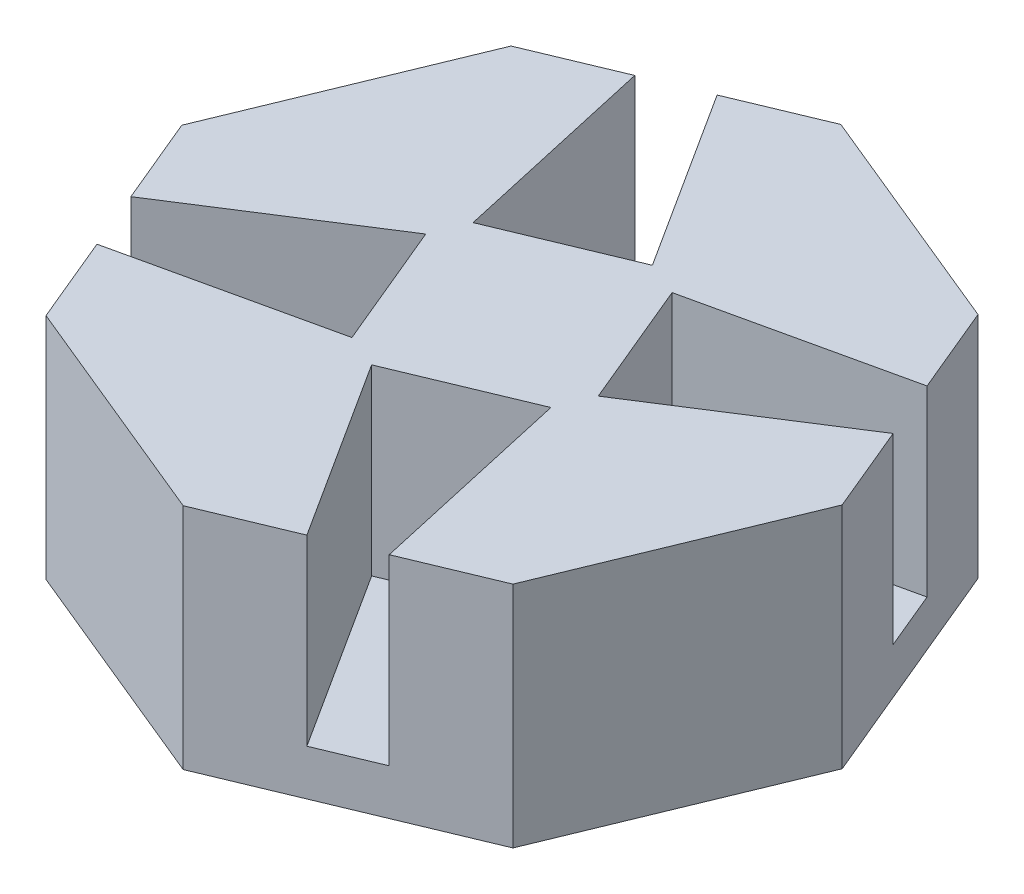
ISO-10303-21;
HEADER;
FILE_DESCRIPTION(('STEP AP214'),'2;1');
FILE_NAME('part.step','',(''),(''),'','','');
FILE_SCHEMA(('AUTOMOTIVE_DESIGN { 1 0 10303 214 1 1 1 1 }'));
ENDSEC;
DATA;
#1=APPLICATION_CONTEXT('core data for automotive mechanical design processes');
#2=APPLICATION_PROTOCOL_DEFINITION('international standard','automotive_design',2000,#1);
#3=PRODUCT_CONTEXT('',#1,'mechanical');
#4=PRODUCT('Part','Part','',(#3));
#5=PRODUCT_RELATED_PRODUCT_CATEGORY('part','',(#4));
#6=PRODUCT_DEFINITION_FORMATION('','',#4);
#7=PRODUCT_DEFINITION_CONTEXT('part definition',#1,'design');
#8=PRODUCT_DEFINITION('design','',#6,#7);
#9=PRODUCT_DEFINITION_SHAPE('','',#8);
#10=(LENGTH_UNIT() NAMED_UNIT(*) SI_UNIT(.MILLI.,.METRE.));
#11=(NAMED_UNIT(*) PLANE_ANGLE_UNIT() SI_UNIT($,.RADIAN.));
#12=(NAMED_UNIT(*) SI_UNIT($,.STERADIAN.) SOLID_ANGLE_UNIT());
#13=UNCERTAINTY_MEASURE_WITH_UNIT(LENGTH_MEASURE(1.E-05),#10,'distance_accuracy_value','');
#14=(GEOMETRIC_REPRESENTATION_CONTEXT(3) GLOBAL_UNCERTAINTY_ASSIGNED_CONTEXT((#13)) GLOBAL_UNIT_ASSIGNED_CONTEXT((#10,
#11,#12)) REPRESENTATION_CONTEXT('',''));
#15=CARTESIAN_POINT('',(0.,0.,0.));
#16=DIRECTION('',(0.,0.,1.));
#17=DIRECTION('',(1.,0.,0.));
#18=AXIS2_PLACEMENT_3D('',#15,#16,#17);
#19=CARTESIAN_POINT('',(-0.111992667325423,38.1,-54.9379232963896));
#20=DIRECTION('',(0.384565990508202,0.,0.923097502403969));
#21=DIRECTION('',(0.923097502403969,0.,-0.384565990508202));
#22=AXIS2_PLACEMENT_3D('',#19,#20,#21);
#23=PLANE('',#22);
#24=DIRECTION('',(0.,1.,0.));
#25=VECTOR('',#24,1.);
#26=CARTESIAN_POINT('',(-24.364776500772,7.62000000000001,-44.8341197293759));
#27=LINE('',#26,#25);
#28=CARTESIAN_POINT('',(-24.364776500772,7.62000000000001,-44.8341197293759));
#29=VERTEX_POINT('',#28);
#30=CARTESIAN_POINT('',(-24.364776500772,38.1,-44.8341197293759));
#31=VERTEX_POINT('',#30);
#32=EDGE_CURVE('E248',#29,#31,#27,.T.);
#33=ORIENTED_EDGE('',*,*,#32,.F.);
#34=DIRECTION('',(-0.923097502403969,0.,0.384565990508202));
#35=VECTOR('',#34,1.);
#36=CARTESIAN_POINT('',(-19.5190807745089,7.62000000000001,-46.8528553145321));
#37=LINE('',#36,#35);
#38=CARTESIAN_POINT('',(-14.6733850482383,7.62000000000001,-48.8715908996914));
#39=VERTEX_POINT('',#38);
#40=EDGE_CURVE('E272',#39,#29,#37,.T.);
#41=ORIENTED_EDGE('',*,*,#40,.F.);
#42=DIRECTION('',(0.,1.,0.));
#43=VECTOR('',#42,1.);
#44=CARTESIAN_POINT('',(-14.6733850482383,7.62000000000001,-48.8715908996914));
#45=LINE('',#44,#43);
#46=CARTESIAN_POINT('',(-14.6733850482383,38.1,-48.8715908996914));
#47=VERTEX_POINT('',#46);
#48=EDGE_CURVE('E288',#39,#47,#45,.T.);
#49=ORIENTED_EDGE('',*,*,#48,.T.);
#50=DIRECTION('',(-0.923097502403969,0.,0.384565990508202));
#51=VECTOR('',#50,1.);
#52=CARTESIAN_POINT('',(-0.111992667325423,38.1,-54.9379232963896));
#53=LINE('',#52,#51);
#54=CARTESIAN_POINT('',(-0.111992667325423,38.1,-54.9379232963896));
#55=VERTEX_POINT('',#54);
#56=EDGE_CURVE('E379',#55,#47,#53,.T.);
#57=ORIENTED_EDGE('',*,*,#56,.F.);
#58=DIRECTION('',(0.,-1.,0.));
#59=VECTOR('',#58,1.);
#60=CARTESIAN_POINT('',(-0.111992667325423,38.1,-54.9379232963896));
#61=LINE('',#60,#59);
#62=CARTESIAN_POINT('',(-0.111992667325423,0.,-54.9379232963896));
#63=VERTEX_POINT('',#62);
#64=EDGE_CURVE('E11',#55,#63,#61,.T.);
#65=ORIENTED_EDGE('',*,*,#64,.T.);
#66=DIRECTION('',(-0.923097502403969,0.,0.384565990508202));
#67=VECTOR('',#66,1.);
#68=CARTESIAN_POINT('',(-0.111992667325423,0.,-54.9379232963896));
#69=LINE('',#68,#67);
#70=CARTESIAN_POINT('',(-38.9261688816924,0.,-38.7677873326745));
#71=VERTEX_POINT('',#70);
#72=EDGE_CURVE('E411',#63,#71,#69,.T.);
#73=ORIENTED_EDGE('',*,*,#72,.T.);
#74=DIRECTION('',(0.,-1.,0.));
#75=VECTOR('',#74,1.);
#76=CARTESIAN_POINT('',(-38.9261688816924,38.1,-38.7677873326745));
#77=LINE('',#76,#75);
#78=CARTESIAN_POINT('',(-38.9261688816924,38.1,-38.7677873326745));
#79=VERTEX_POINT('',#78);
#80=EDGE_CURVE('E54',#79,#71,#77,.T.);
#81=ORIENTED_EDGE('',*,*,#80,.F.);
#82=EDGE_CURVE('E377',#31,#79,#53,.T.);
#83=ORIENTED_EDGE('',*,*,#82,.F.);
#84=EDGE_LOOP('',(#33,#41,#49,#57,#65,#73,#81,#83));
#85=FACE_BOUND('',#84,.T.);
#86=ADVANCED_FACE('F45',(#85),#23,.F.);
#87=CARTESIAN_POINT('',(-54.9379232963896,38.1,0.111992667325427));
#88=DIRECTION('',(0.923097502403969,0.,-0.384565990508202));
#89=DIRECTION('',(-0.384565990508203,0.,-0.923097502403969));
#90=AXIS2_PLACEMENT_3D('',#87,#88,#89);
#91=PLANE('',#90);
#92=DIRECTION('',(0.,1.,0.));
#93=VECTOR('',#92,1.);
#94=CARTESIAN_POINT('',(-44.8341197293752,7.62000000000001,24.3647765007735));
#95=LINE('',#94,#93);
#96=CARTESIAN_POINT('',(-44.8341197293752,7.62000000000001,24.3647765007735));
#97=VERTEX_POINT('',#96);
#98=CARTESIAN_POINT('',(-44.8341197293752,38.1,24.3647765007735));
#99=VERTEX_POINT('',#98);
#100=EDGE_CURVE('E251',#97,#99,#95,.T.);
#101=ORIENTED_EDGE('',*,*,#100,.F.);
#102=DIRECTION('',(0.384565990508203,0.,0.923097502403969));
#103=VECTOR('',#102,1.);
#104=CARTESIAN_POINT('',(-46.8528553145321,7.62000000000001,19.5190807745089));
#105=LINE('',#104,#103);
#106=CARTESIAN_POINT('',(-48.8715908996905,7.62000000000001,14.6733850482405));
#107=VERTEX_POINT('',#106);
#108=EDGE_CURVE('E230',#107,#97,#105,.T.);
#109=ORIENTED_EDGE('',*,*,#108,.F.);
#110=DIRECTION('',(0.,1.,0.));
#111=VECTOR('',#110,1.);
#112=CARTESIAN_POINT('',(-48.8715908996905,7.62000000000001,14.6733850482405));
#113=LINE('',#112,#111);
#114=CARTESIAN_POINT('',(-48.8715908996905,38.1,14.6733850482405));
#115=VERTEX_POINT('',#114);
#116=EDGE_CURVE('E255',#107,#115,#113,.T.);
#117=ORIENTED_EDGE('',*,*,#116,.T.);
#118=DIRECTION('',(0.384565990508203,0.,0.923097502403969));
#119=VECTOR('',#118,1.);
#120=CARTESIAN_POINT('',(-54.9379232963896,38.1,0.111992667325427));
#121=LINE('',#120,#119);
#122=CARTESIAN_POINT('',(-54.9379232963896,38.1,0.111992667325427));
#123=VERTEX_POINT('',#122);
#124=EDGE_CURVE('E387',#123,#115,#121,.T.);
#125=ORIENTED_EDGE('',*,*,#124,.F.);
#126=DIRECTION('',(0.,-1.,0.));
#127=VECTOR('',#126,1.);
#128=CARTESIAN_POINT('',(-54.9379232963896,38.1,0.111992667325427));
#129=LINE('',#128,#127);
#130=CARTESIAN_POINT('',(-54.9379232963896,0.,0.111992667325427));
#131=VERTEX_POINT('',#130);
#132=EDGE_CURVE('E450',#123,#131,#129,.T.);
#133=ORIENTED_EDGE('',*,*,#132,.T.);
#134=DIRECTION('',(0.384565990508203,0.,0.923097502403969));
#135=VECTOR('',#134,1.);
#136=CARTESIAN_POINT('',(-54.9379232963896,0.,0.111992667325427));
#137=LINE('',#136,#135);
#138=CARTESIAN_POINT('',(-38.7677873326745,0.,38.9261688816925));
#139=VERTEX_POINT('',#138);
#140=EDGE_CURVE('E417',#131,#139,#137,.T.);
#141=ORIENTED_EDGE('',*,*,#140,.T.);
#142=DIRECTION('',(0.,-1.,0.));
#143=VECTOR('',#142,1.);
#144=CARTESIAN_POINT('',(-38.7677873326745,38.1,38.9261688816925));
#145=LINE('',#144,#143);
#146=CARTESIAN_POINT('',(-38.7677873326745,38.1,38.9261688816925));
#147=VERTEX_POINT('',#146);
#148=EDGE_CURVE('E446',#147,#139,#145,.T.);
#149=ORIENTED_EDGE('',*,*,#148,.F.);
#150=EDGE_CURVE('E386',#99,#147,#121,.T.);
#151=ORIENTED_EDGE('',*,*,#150,.F.);
#152=EDGE_LOOP('',(#101,#109,#117,#125,#133,#141,#149,#151));
#153=FACE_BOUND('',#152,.T.);
#154=ADVANCED_FACE('F471',(#153),#91,.F.);
#155=CARTESIAN_POINT('',(0.111992667325429,38.1,54.9379232963896));
#156=DIRECTION('',(-0.384565990508203,0.,-0.923097502403969));
#157=DIRECTION('',(-0.923097502403969,0.,0.384565990508203));
#158=AXIS2_PLACEMENT_3D('',#155,#156,#157);
#159=PLANE('',#158);
#160=DIRECTION('',(0.,1.,0.));
#161=VECTOR('',#160,1.);
#162=CARTESIAN_POINT('',(24.3647765007757,7.62000000000001,44.8341197293743));
#163=LINE('',#162,#161);
#164=CARTESIAN_POINT('',(24.3647765007757,7.62000000000001,44.8341197293743));
#165=VERTEX_POINT('',#164);
#166=CARTESIAN_POINT('',(24.3647765007757,38.1,44.8341197293743));
#167=VERTEX_POINT('',#166);
#168=EDGE_CURVE('E363',#165,#167,#163,.T.);
#169=ORIENTED_EDGE('',*,*,#168,.F.);
#170=DIRECTION('',(0.923097502403969,0.,-0.384565990508203));
#171=VECTOR('',#170,1.);
#172=CARTESIAN_POINT('',(19.519080774509,7.62000000000001,46.8528553145321));
#173=LINE('',#172,#171);
#174=CARTESIAN_POINT('',(14.673385048242,7.62000000000001,48.8715908996899));
#175=VERTEX_POINT('',#174);
#176=EDGE_CURVE('E341',#175,#165,#173,.T.);
#177=ORIENTED_EDGE('',*,*,#176,.F.);
#178=DIRECTION('',(0.,1.,0.));
#179=VECTOR('',#178,1.);
#180=CARTESIAN_POINT('',(14.673385048242,7.62000000000001,48.8715908996899));
#181=LINE('',#180,#179);
#182=CARTESIAN_POINT('',(14.673385048242,38.1,48.8715908996899));
#183=VERTEX_POINT('',#182);
#184=EDGE_CURVE('E366',#175,#183,#181,.T.);
#185=ORIENTED_EDGE('',*,*,#184,.T.);
#186=DIRECTION('',(0.923097502403969,0.,-0.384565990508203));
#187=VECTOR('',#186,1.);
#188=CARTESIAN_POINT('',(0.111992667325429,38.1,54.9379232963896));
#189=LINE('',#188,#187);
#190=CARTESIAN_POINT('',(0.111992667325429,38.1,54.9379232963896));
#191=VERTEX_POINT('',#190);
#192=EDGE_CURVE('E395',#191,#183,#189,.T.);
#193=ORIENTED_EDGE('',*,*,#192,.F.);
#194=DIRECTION('',(0.,-1.,0.));
#195=VECTOR('',#194,1.);
#196=CARTESIAN_POINT('',(0.111992667325429,38.1,54.9379232963896));
#197=LINE('',#196,#195);
#198=CARTESIAN_POINT('',(0.111992667325429,0.,54.9379232963896));
#199=VERTEX_POINT('',#198);
#200=EDGE_CURVE('E442',#191,#199,#197,.T.);
#201=ORIENTED_EDGE('',*,*,#200,.T.);
#202=DIRECTION('',(0.923097502403969,0.,-0.384565990508203));
#203=VECTOR('',#202,1.);
#204=CARTESIAN_POINT('',(0.111992667325429,0.,54.9379232963896));
#205=LINE('',#204,#203);
#206=CARTESIAN_POINT('',(38.9261688816925,0.,38.7677873326745));
#207=VERTEX_POINT('',#206);
#208=EDGE_CURVE('E423',#199,#207,#205,.T.);
#209=ORIENTED_EDGE('',*,*,#208,.T.);
#210=DIRECTION('',(0.,-1.,0.));
#211=VECTOR('',#210,1.);
#212=CARTESIAN_POINT('',(38.9261688816925,38.1,38.7677873326745));
#213=LINE('',#212,#211);
#214=CARTESIAN_POINT('',(38.9261688816925,38.1,38.7677873326745));
#215=VERTEX_POINT('',#214);
#216=EDGE_CURVE('E438',#215,#207,#213,.T.);
#217=ORIENTED_EDGE('',*,*,#216,.F.);
#218=EDGE_CURVE('E394',#167,#215,#189,.T.);
#219=ORIENTED_EDGE('',*,*,#218,.F.);
#220=EDGE_LOOP('',(#169,#177,#185,#193,#201,#209,#217,#219));
#221=FACE_BOUND('',#220,.T.);
#222=ADVANCED_FACE('F515',(#221),#159,.F.);
#223=CARTESIAN_POINT('',(54.9379232963896,38.1,-0.111992667325405));
#224=DIRECTION('',(-0.923097502403969,0.,0.384565990508202));
#225=DIRECTION('',(0.384565990508202,0.,0.923097502403969));
#226=AXIS2_PLACEMENT_3D('',#223,#224,#225);
#227=PLANE('',#226);
#228=DIRECTION('',(0.,1.,0.));
#229=VECTOR('',#228,1.);
#230=CARTESIAN_POINT('',(44.834119729375,7.62000000000001,-24.3647765007741));
#231=LINE('',#230,#229);
#232=CARTESIAN_POINT('',(44.834119729375,7.62000000000001,-24.3647765007741));
#233=VERTEX_POINT('',#232);
#234=CARTESIAN_POINT('',(44.834119729375,38.1,-24.3647765007741));
#235=VERTEX_POINT('',#234);
#236=EDGE_CURVE('E280',#233,#235,#231,.T.);
#237=ORIENTED_EDGE('',*,*,#236,.F.);
#238=DIRECTION('',(-0.384565990508202,0.,-0.923097502403969));
#239=VECTOR('',#238,1.);
#240=CARTESIAN_POINT('',(46.8528553145321,7.62000000000001,-19.5190807745089));
#241=LINE('',#240,#239);
#242=CARTESIAN_POINT('',(48.8715908996908,7.62000000000001,-14.6733850482398));
#243=VERTEX_POINT('',#242);
#244=EDGE_CURVE('E308',#243,#233,#241,.T.);
#245=ORIENTED_EDGE('',*,*,#244,.F.);
#246=DIRECTION('',(0.,1.,0.));
#247=VECTOR('',#246,1.);
#248=CARTESIAN_POINT('',(48.8715908996908,7.62000000000001,-14.6733850482398));
#249=LINE('',#248,#247);
#250=CARTESIAN_POINT('',(48.8715908996908,38.1,-14.6733850482398));
#251=VERTEX_POINT('',#250);
#252=EDGE_CURVE('E323',#243,#251,#249,.T.);
#253=ORIENTED_EDGE('',*,*,#252,.T.);
#254=DIRECTION('',(-0.384565990508202,0.,-0.923097502403969));
#255=VECTOR('',#254,1.);
#256=CARTESIAN_POINT('',(54.9379232963896,38.1,-0.111992667325405));
#257=LINE('',#256,#255);
#258=CARTESIAN_POINT('',(54.9379232963896,38.1,-0.111992667325405));
#259=VERTEX_POINT('',#258);
#260=EDGE_CURVE('E403',#259,#251,#257,.T.);
#261=ORIENTED_EDGE('',*,*,#260,.F.);
#262=DIRECTION('',(0.,-1.,0.));
#263=VECTOR('',#262,1.);
#264=CARTESIAN_POINT('',(54.9379232963896,38.1,-0.111992667325405));
#265=LINE('',#264,#263);
#266=CARTESIAN_POINT('',(54.9379232963896,0.,-0.111992667325405));
#267=VERTEX_POINT('',#266);
#268=EDGE_CURVE('E434',#259,#267,#265,.T.);
#269=ORIENTED_EDGE('',*,*,#268,.T.);
#270=DIRECTION('',(-0.384565990508202,0.,-0.923097502403969));
#271=VECTOR('',#270,1.);
#272=CARTESIAN_POINT('',(54.9379232963896,0.,-0.111992667325405));
#273=LINE('',#272,#271);
#274=CARTESIAN_POINT('',(38.7677873326746,0.,-38.9261688816924));
#275=VERTEX_POINT('',#274);
#276=EDGE_CURVE('E378',#267,#275,#273,.T.);
#277=ORIENTED_EDGE('',*,*,#276,.T.);
#278=DIRECTION('',(0.,-1.,0.));
#279=VECTOR('',#278,1.);
#280=CARTESIAN_POINT('',(38.7677873326746,38.1,-38.9261688816924));
#281=LINE('',#280,#279);
#282=CARTESIAN_POINT('',(38.7677873326746,38.1,-38.9261688816924));
#283=VERTEX_POINT('',#282);
#284=EDGE_CURVE('E407',#283,#275,#281,.T.);
#285=ORIENTED_EDGE('',*,*,#284,.F.);
#286=EDGE_CURVE('E402',#235,#283,#257,.T.);
#287=ORIENTED_EDGE('',*,*,#286,.F.);
#288=EDGE_LOOP('',(#237,#245,#253,#261,#269,#277,#285,#287));
#289=FACE_BOUND('',#288,.T.);
#290=ADVANCED_FACE('F505',(#289),#227,.F.);
#291=CARTESIAN_POINT('',(0.,38.1,0.));
#292=DIRECTION('',(0.,1.,0.));
#293=DIRECTION('',(0.,0.,1.));
#294=AXIS2_PLACEMENT_3D('',#291,#292,#293);
#295=PLANE('',#294);
#296=DIRECTION('',(-0.384565990508192,0.,-0.923097502403973));
#297=VECTOR('',#296,1.);
#298=CARTESIAN_POINT('',(14.4964416602701,38.1,-6.03927367521602));
#299=LINE('',#298,#297);
#300=CARTESIAN_POINT('',(18.8920309317793,38.1,4.51173077726273));
#301=VERTEX_POINT('',#300);
#302=CARTESIAN_POINT('',(10.100852388762,38.1,-16.5902781276921));
#303=VERTEX_POINT('',#302);
#304=EDGE_CURVE('E315',#301,#303,#299,.T.);
#305=ORIENTED_EDGE('',*,*,#304,.T.);
#306=DIRECTION('',(0.975852760598065,0.,-0.218429369895938));
#307=VECTOR('',#306,1.);
#308=CARTESIAN_POINT('',(-3.05437343120183,38.1,-13.645686686528));
#309=LINE('',#308,#307);
#310=EDGE_CURVE('E61',#303,#235,#309,.T.);
#311=ORIENTED_EDGE('',*,*,#310,.T.);
#312=ORIENTED_EDGE('',*,*,#286,.T.);
#313=DIRECTION('',(-0.924657723348283,0.,-0.38079928394414));
#314=VECTOR('',#313,1.);
#315=CARTESIAN_POINT('',(38.7677873326746,38.1,-38.9261688816924));
#316=LINE('',#315,#314);
#317=EDGE_CURVE('E373',#283,#55,#316,.T.);
#318=ORIENTED_EDGE('',*,*,#317,.T.);
#319=ORIENTED_EDGE('',*,*,#56,.T.);
#320=DIRECTION('',(-0.539017768098629,0.,-0.842294393709214));
#321=VECTOR('',#320,1.);
#322=CARTESIAN_POINT('',(11.7780938461807,38.1,-7.53727189073072));
#323=LINE('',#322,#321);
#324=CARTESIAN_POINT('',(4.51173077726535,38.1,-18.8920309317781));
#325=VERTEX_POINT('',#324);
#326=EDGE_CURVE('E265',#325,#47,#323,.T.);
#327=ORIENTED_EDGE('',*,*,#326,.F.);
#328=DIRECTION('',(-0.923097502403973,0.,0.384565990508192));
#329=VECTOR('',#328,1.);
#330=CARTESIAN_POINT('',(-6.03927367521523,38.1,-14.4964416602682));
#331=LINE('',#330,#329);
#332=CARTESIAN_POINT('',(-16.5902781276895,38.1,-10.1008523887609));
#333=VERTEX_POINT('',#332);
#334=EDGE_CURVE('E279',#325,#333,#331,.T.);
#335=ORIENTED_EDGE('',*,*,#334,.T.);
#336=DIRECTION('',(-0.218429369895938,0.,-0.975852760598065));
#337=VECTOR('',#336,1.);
#338=CARTESIAN_POINT('',(-13.6456866865257,38.1,3.05437343120133));
#339=LINE('',#338,#337);
#340=EDGE_CURVE('E69',#333,#31,#339,.T.);
#341=ORIENTED_EDGE('',*,*,#340,.T.);
#342=ORIENTED_EDGE('',*,*,#82,.T.);
#343=DIRECTION('',(-0.38079928394414,0.,0.924657723348283));
#344=VECTOR('',#343,1.);
#345=CARTESIAN_POINT('',(-38.9261688816924,38.1,-38.7677873326745));
#346=LINE('',#345,#344);
#347=EDGE_CURVE('E383',#79,#123,#346,.T.);
#348=ORIENTED_EDGE('',*,*,#347,.T.);
#349=ORIENTED_EDGE('',*,*,#124,.T.);
#350=DIRECTION('',(-0.842294393709214,0.,0.539017768098629));
#351=VECTOR('',#350,1.);
#352=CARTESIAN_POINT('',(-7.53727189072944,38.1,-11.7780938461787));
#353=LINE('',#352,#351);
#354=CARTESIAN_POINT('',(-18.8920309317755,38.1,-4.51173077726422));
#355=VERTEX_POINT('',#354);
#356=EDGE_CURVE('E236',#355,#115,#353,.T.);
#357=ORIENTED_EDGE('',*,*,#356,.F.);
#358=DIRECTION('',(0.384565990508192,0.,0.923097502403973));
#359=VECTOR('',#358,1.);
#360=CARTESIAN_POINT('',(-14.4964416602663,38.1,6.03927367521447));
#361=LINE('',#360,#359);
#362=CARTESIAN_POINT('',(-10.1008523887582,38.1,16.5902781276906));
#363=VERTEX_POINT('',#362);
#364=EDGE_CURVE('E239',#355,#363,#361,.T.);
#365=ORIENTED_EDGE('',*,*,#364,.T.);
#366=DIRECTION('',(-0.975852760598065,0.,0.218429369895938));
#367=VECTOR('',#366,1.);
#368=CARTESIAN_POINT('',(3.05437343120169,38.1,13.6456866865273));
#369=LINE('',#368,#367);
#370=EDGE_CURVE('E228',#363,#99,#369,.T.);
#371=ORIENTED_EDGE('',*,*,#370,.T.);
#372=ORIENTED_EDGE('',*,*,#150,.T.);
#373=DIRECTION('',(0.924657723348283,0.,0.38079928394414));
#374=VECTOR('',#373,1.);
#375=CARTESIAN_POINT('',(-38.7677873326745,38.1,38.9261688816925));
#376=LINE('',#375,#374);
#377=EDGE_CURVE('E391',#147,#191,#376,.T.);
#378=ORIENTED_EDGE('',*,*,#377,.T.);
#379=ORIENTED_EDGE('',*,*,#192,.T.);
#380=DIRECTION('',(0.539017768098629,0.,0.842294393709214));
#381=VECTOR('',#380,1.);
#382=CARTESIAN_POINT('',(-11.7780938461774,38.1,7.53727189072858));
#383=LINE('',#382,#381);
#384=CARTESIAN_POINT('',(-4.5117307772616,38.1,18.8920309317766));
#385=VERTEX_POINT('',#384);
#386=EDGE_CURVE('E352',#385,#183,#383,.T.);
#387=ORIENTED_EDGE('',*,*,#386,.F.);
#388=DIRECTION('',(0.923097502403973,0.,-0.384565990508192));
#389=VECTOR('',#388,1.);
#390=CARTESIAN_POINT('',(6.03927367521526,38.1,14.4964416602682));
#391=LINE('',#390,#389);
#392=CARTESIAN_POINT('',(16.5902781276932,38.1,10.1008523887594));
#393=VERTEX_POINT('',#392);
#394=EDGE_CURVE('E254',#385,#393,#391,.T.);
#395=ORIENTED_EDGE('',*,*,#394,.T.);
#396=DIRECTION('',(0.218429369895938,0.,0.975852760598065));
#397=VECTOR('',#396,1.);
#398=CARTESIAN_POINT('',(13.6456866865296,38.1,-3.05437343120219));
#399=LINE('',#398,#397);
#400=EDGE_CURVE('E337',#393,#167,#399,.T.);
#401=ORIENTED_EDGE('',*,*,#400,.T.);
#402=ORIENTED_EDGE('',*,*,#218,.T.);
#403=DIRECTION('',(0.38079928394414,0.,-0.924657723348283));
#404=VECTOR('',#403,1.);
#405=CARTESIAN_POINT('',(38.9261688816925,38.1,38.7677873326745));
#406=LINE('',#405,#404);
#407=EDGE_CURVE('E399',#215,#259,#406,.T.);
#408=ORIENTED_EDGE('',*,*,#407,.T.);
#409=ORIENTED_EDGE('',*,*,#260,.T.);
#410=DIRECTION('',(0.842294393709214,0.,-0.539017768098629));
#411=VECTOR('',#410,1.);
#412=CARTESIAN_POINT('',(7.53727189072986,38.1,11.7780938461794));
#413=LINE('',#412,#411);
#414=EDGE_CURVE('E301',#301,#251,#413,.T.);
#415=ORIENTED_EDGE('',*,*,#414,.F.);
#416=EDGE_LOOP('',(#305,#311,#312,#318,#319,#327,#335,#341,#342,#348,#349,#357,#365,#371,#372,
#378,#379,#387,#395,#401,#402,#408,#409,#415));
#417=FACE_BOUND('',#416,.T.);
#418=ADVANCED_FACE('F480',(#417),#295,.T.);
#419=CARTESIAN_POINT('',(38.7677873326746,38.1,-38.9261688816924));
#420=DIRECTION('',(-0.38079928394414,0.,0.924657723348283));
#421=DIRECTION('',(0.924657723348283,0.,0.38079928394414));
#422=AXIS2_PLACEMENT_3D('',#419,#420,#421);
#423=PLANE('',#422);
#424=DIRECTION('',(-0.924657723348283,0.,-0.38079928394414));
#425=VECTOR('',#424,1.);
#426=CARTESIAN_POINT('',(38.7677873326746,0.,-38.9261688816924));
#427=LINE('',#426,#425);
#428=EDGE_CURVE('E362',#275,#63,#427,.T.);
#429=ORIENTED_EDGE('',*,*,#428,.T.);
#430=ORIENTED_EDGE('',*,*,#64,.F.);
#431=ORIENTED_EDGE('',*,*,#317,.F.);
#432=ORIENTED_EDGE('',*,*,#284,.T.);
#433=EDGE_LOOP('',(#429,#430,#431,#432));
#434=FACE_BOUND('',#433,.T.);
#435=ADVANCED_FACE('F47',(#434),#423,.F.);
#436=CARTESIAN_POINT('',(-38.9261688816924,38.1,-38.7677873326745));
#437=DIRECTION('',(0.924657723348283,0.,0.38079928394414));
#438=DIRECTION('',(0.38079928394414,0.,-0.924657723348283));
#439=AXIS2_PLACEMENT_3D('',#436,#437,#438);
#440=PLANE('',#439);
#441=DIRECTION('',(-0.38079928394414,0.,0.924657723348283));
#442=VECTOR('',#441,1.);
#443=CARTESIAN_POINT('',(-38.9261688816924,0.,-38.7677873326745));
#444=LINE('',#443,#442);
#445=EDGE_CURVE('E414',#71,#131,#444,.T.);
#446=ORIENTED_EDGE('',*,*,#445,.T.);
#447=ORIENTED_EDGE('',*,*,#132,.F.);
#448=ORIENTED_EDGE('',*,*,#347,.F.);
#449=ORIENTED_EDGE('',*,*,#80,.T.);
#450=EDGE_LOOP('',(#446,#447,#448,#449));
#451=FACE_BOUND('',#450,.T.);
#452=ADVANCED_FACE('F459',(#451),#440,.F.);
#453=CARTESIAN_POINT('',(-38.7677873326745,38.1,38.9261688816925));
#454=DIRECTION('',(0.38079928394414,0.,-0.924657723348283));
#455=DIRECTION('',(-0.924657723348283,0.,-0.38079928394414));
#456=AXIS2_PLACEMENT_3D('',#453,#454,#455);
#457=PLANE('',#456);
#458=DIRECTION('',(0.924657723348283,0.,0.38079928394414));
#459=VECTOR('',#458,1.);
#460=CARTESIAN_POINT('',(-38.7677873326745,0.,38.9261688816925));
#461=LINE('',#460,#459);
#462=EDGE_CURVE('E420',#139,#199,#461,.T.);
#463=ORIENTED_EDGE('',*,*,#462,.T.);
#464=ORIENTED_EDGE('',*,*,#200,.F.);
#465=ORIENTED_EDGE('',*,*,#377,.F.);
#466=ORIENTED_EDGE('',*,*,#148,.T.);
#467=EDGE_LOOP('',(#463,#464,#465,#466));
#468=FACE_BOUND('',#467,.T.);
#469=ADVANCED_FACE('F476',(#468),#457,.F.);
#470=CARTESIAN_POINT('',(38.9261688816925,38.1,38.7677873326745));
#471=DIRECTION('',(-0.924657723348283,0.,-0.38079928394414));
#472=DIRECTION('',(-0.38079928394414,0.,0.924657723348283));
#473=AXIS2_PLACEMENT_3D('',#470,#471,#472);
#474=PLANE('',#473);
#475=DIRECTION('',(0.38079928394414,0.,-0.924657723348283));
#476=VECTOR('',#475,1.);
#477=CARTESIAN_POINT('',(38.9261688816925,0.,38.7677873326745));
#478=LINE('',#477,#476);
#479=EDGE_CURVE('E426',#207,#267,#478,.T.);
#480=ORIENTED_EDGE('',*,*,#479,.T.);
#481=ORIENTED_EDGE('',*,*,#268,.F.);
#482=ORIENTED_EDGE('',*,*,#407,.F.);
#483=ORIENTED_EDGE('',*,*,#216,.T.);
#484=EDGE_LOOP('',(#480,#481,#482,#483));
#485=FACE_BOUND('',#484,.T.);
#486=ADVANCED_FACE('F510',(#485),#474,.F.);
#487=CARTESIAN_POINT('',(0.,0.,0.));
#488=DIRECTION('',(0.,1.,0.));
#489=DIRECTION('',(0.,0.,1.));
#490=AXIS2_PLACEMENT_3D('',#487,#488,#489);
#491=PLANE('',#490);
#492=ORIENTED_EDGE('',*,*,#428,.F.);
#493=ORIENTED_EDGE('',*,*,#276,.F.);
#494=ORIENTED_EDGE('',*,*,#479,.F.);
#495=ORIENTED_EDGE('',*,*,#208,.F.);
#496=ORIENTED_EDGE('',*,*,#462,.F.);
#497=ORIENTED_EDGE('',*,*,#140,.F.);
#498=ORIENTED_EDGE('',*,*,#445,.F.);
#499=ORIENTED_EDGE('',*,*,#72,.F.);
#500=EDGE_LOOP('',(#492,#493,#494,#495,#496,#497,#498,#499));
#501=FACE_BOUND('',#500,.T.);
#502=ADVANCED_FACE('F466',(#501),#491,.F.);
#503=CARTESIAN_POINT('',(6.03927367521526,7.62000000000001,14.4964416602682));
#504=DIRECTION('',(0.384565990508192,0.,0.923097502403973));
#505=DIRECTION('',(0.923097502403973,0.,-0.384565990508192));
#506=AXIS2_PLACEMENT_3D('',#503,#504,#505);
#507=PLANE('',#506);
#508=ORIENTED_EDGE('',*,*,#394,.F.);
#509=DIRECTION('',(0.,1.,0.));
#510=VECTOR('',#509,1.);
#511=CARTESIAN_POINT('',(-4.5117307772616,7.62000000000001,18.8920309317766));
#512=LINE('',#511,#510);
#513=CARTESIAN_POINT('',(-4.5117307772616,7.62000000000001,18.8920309317766));
#514=VERTEX_POINT('',#513);
#515=EDGE_CURVE('E348',#514,#385,#512,.T.);
#516=ORIENTED_EDGE('',*,*,#515,.F.);
#517=DIRECTION('',(0.923097502403973,0.,-0.384565990508192));
#518=VECTOR('',#517,1.);
#519=CARTESIAN_POINT('',(6.03927367521526,7.62000000000001,14.4964416602682));
#520=LINE('',#519,#518);
#521=CARTESIAN_POINT('',(16.5902781276932,7.62000000000001,10.1008523887594));
#522=VERTEX_POINT('',#521);
#523=EDGE_CURVE('E332',#514,#522,#520,.T.);
#524=ORIENTED_EDGE('',*,*,#523,.T.);
#525=DIRECTION('',(0.,1.,0.));
#526=VECTOR('',#525,1.);
#527=CARTESIAN_POINT('',(16.5902781276932,7.62000000000001,10.1008523887594));
#528=LINE('',#527,#526);
#529=EDGE_CURVE('E358',#522,#393,#528,.T.);
#530=ORIENTED_EDGE('',*,*,#529,.T.);
#531=EDGE_LOOP('',(#508,#516,#524,#530));
#532=FACE_BOUND('',#531,.T.);
#533=ADVANCED_FACE('F525',(#532),#507,.T.);
#534=CARTESIAN_POINT('',(13.6456866865296,7.62000000000001,-3.05437343120219));
#535=DIRECTION('',(-0.975852760598065,0.,0.218429369895938));
#536=DIRECTION('',(0.218429369895938,0.,0.975852760598065));
#537=AXIS2_PLACEMENT_3D('',#534,#535,#536);
#538=PLANE('',#537);
#539=ORIENTED_EDGE('',*,*,#400,.F.);
#540=ORIENTED_EDGE('',*,*,#529,.F.);
#541=DIRECTION('',(0.218429369895938,0.,0.975852760598065));
#542=VECTOR('',#541,1.);
#543=CARTESIAN_POINT('',(13.6456866865296,7.62000000000001,-3.05437343120219));
#544=LINE('',#543,#542);
#545=EDGE_CURVE('E345',#522,#165,#544,.T.);
#546=ORIENTED_EDGE('',*,*,#545,.T.);
#547=ORIENTED_EDGE('',*,*,#168,.T.);
#548=EDGE_LOOP('',(#539,#540,#546,#547));
#549=FACE_BOUND('',#548,.T.);
#550=ADVANCED_FACE('F527',(#549),#538,.T.);
#551=CARTESIAN_POINT('',(-11.7780938461774,7.62000000000001,7.53727189072858));
#552=DIRECTION('',(-0.842294393709214,0.,0.539017768098629));
#553=DIRECTION('',(0.539017768098629,0.,0.842294393709214));
#554=AXIS2_PLACEMENT_3D('',#551,#552,#553);
#555=PLANE('',#554);
#556=ORIENTED_EDGE('',*,*,#386,.T.);
#557=ORIENTED_EDGE('',*,*,#184,.F.);
#558=DIRECTION('',(0.539017768098629,0.,0.842294393709214));
#559=VECTOR('',#558,1.);
#560=CARTESIAN_POINT('',(-11.7780938461774,7.62000000000001,7.53727189072858));
#561=LINE('',#560,#559);
#562=EDGE_CURVE('E336',#514,#175,#561,.T.);
#563=ORIENTED_EDGE('',*,*,#562,.F.);
#564=ORIENTED_EDGE('',*,*,#515,.T.);
#565=EDGE_LOOP('',(#556,#557,#563,#564));
#566=FACE_BOUND('',#565,.T.);
#567=ADVANCED_FACE('F519',(#566),#555,.F.);
#568=CARTESIAN_POINT('',(0.,7.62000000000001,0.));
#569=DIRECTION('',(0.,1.,0.));
#570=DIRECTION('',(0.,0.,1.));
#571=AXIS2_PLACEMENT_3D('',#568,#569,#570);
#572=PLANE('',#571);
#573=ORIENTED_EDGE('',*,*,#523,.F.);
#574=ORIENTED_EDGE('',*,*,#562,.T.);
#575=ORIENTED_EDGE('',*,*,#176,.T.);
#576=ORIENTED_EDGE('',*,*,#545,.F.);
#577=EDGE_LOOP('',(#573,#574,#575,#576));
#578=FACE_BOUND('',#577,.T.);
#579=ADVANCED_FACE('F522',(#578),#572,.T.);
#580=CARTESIAN_POINT('',(3.05437343120169,7.62000000000001,13.6456866865273));
#581=DIRECTION('',(-0.218429369895938,0.,-0.975852760598065));
#582=DIRECTION('',(-0.975852760598065,0.,0.218429369895938));
#583=AXIS2_PLACEMENT_3D('',#580,#581,#582);
#584=PLANE('',#583);
#585=ORIENTED_EDGE('',*,*,#370,.F.);
#586=DIRECTION('',(0.,1.,0.));
#587=VECTOR('',#586,1.);
#588=CARTESIAN_POINT('',(-10.1008523887582,7.62000000000001,16.5902781276906));
#589=LINE('',#588,#587);
#590=CARTESIAN_POINT('',(-10.1008523887582,7.62000000000001,16.5902781276906));
#591=VERTEX_POINT('',#590);
#592=EDGE_CURVE('E213',#591,#363,#589,.T.);
#593=ORIENTED_EDGE('',*,*,#592,.F.);
#594=DIRECTION('',(-0.975852760598065,0.,0.218429369895938));
#595=VECTOR('',#594,1.);
#596=CARTESIAN_POINT('',(3.05437343120169,7.62000000000001,13.6456866865273));
#597=LINE('',#596,#595);
#598=EDGE_CURVE('E222',#591,#97,#597,.T.);
#599=ORIENTED_EDGE('',*,*,#598,.T.);
#600=ORIENTED_EDGE('',*,*,#100,.T.);
#601=EDGE_LOOP('',(#585,#593,#599,#600));
#602=FACE_BOUND('',#601,.T.);
#603=ADVANCED_FACE('F225',(#602),#584,.T.);
#604=CARTESIAN_POINT('',(-7.53727189072944,7.62000000000001,-11.7780938461787));
#605=DIRECTION('',(-0.539017768098629,0.,-0.842294393709214));
#606=DIRECTION('',(-0.842294393709214,0.,0.539017768098629));
#607=AXIS2_PLACEMENT_3D('',#604,#605,#606);
#608=PLANE('',#607);
#609=ORIENTED_EDGE('',*,*,#356,.T.);
#610=ORIENTED_EDGE('',*,*,#116,.F.);
#611=DIRECTION('',(-0.842294393709214,0.,0.539017768098629));
#612=VECTOR('',#611,1.);
#613=CARTESIAN_POINT('',(-7.53727189072944,7.62000000000001,-11.7780938461787));
#614=LINE('',#613,#612);
#615=CARTESIAN_POINT('',(-18.8920309317755,7.62000000000001,-4.51173077726422));
#616=VERTEX_POINT('',#615);
#617=EDGE_CURVE('E221',#616,#107,#614,.T.);
#618=ORIENTED_EDGE('',*,*,#617,.F.);
#619=DIRECTION('',(0.,1.,0.));
#620=VECTOR('',#619,1.);
#621=CARTESIAN_POINT('',(-18.8920309317755,7.62000000000001,-4.51173077726422));
#622=LINE('',#621,#620);
#623=EDGE_CURVE('E215',#616,#355,#622,.T.);
#624=ORIENTED_EDGE('',*,*,#623,.T.);
#625=EDGE_LOOP('',(#609,#610,#618,#624));
#626=FACE_BOUND('',#625,.T.);
#627=ADVANCED_FACE('F583',(#626),#608,.F.);
#628=CARTESIAN_POINT('',(-14.4964416602663,7.62000000000001,6.03927367521447));
#629=DIRECTION('',(-0.923097502403973,0.,0.384565990508192));
#630=DIRECTION('',(0.384565990508192,0.,0.923097502403973));
#631=AXIS2_PLACEMENT_3D('',#628,#629,#630);
#632=PLANE('',#631);
#633=ORIENTED_EDGE('',*,*,#364,.F.);
#634=ORIENTED_EDGE('',*,*,#623,.F.);
#635=DIRECTION('',(0.384565990508192,0.,0.923097502403973));
#636=VECTOR('',#635,1.);
#637=CARTESIAN_POINT('',(-14.4964416602663,7.62000000000001,6.03927367521447));
#638=LINE('',#637,#636);
#639=EDGE_CURVE('E209',#616,#591,#638,.T.);
#640=ORIENTED_EDGE('',*,*,#639,.T.);
#641=ORIENTED_EDGE('',*,*,#592,.T.);
#642=EDGE_LOOP('',(#633,#634,#640,#641));
#643=FACE_BOUND('',#642,.T.);
#644=ADVANCED_FACE('F212',(#643),#632,.T.);
#645=CARTESIAN_POINT('',(0.,7.62000000000001,0.));
#646=DIRECTION('',(0.,1.,0.));
#647=DIRECTION('',(0.,0.,1.));
#648=AXIS2_PLACEMENT_3D('',#645,#646,#647);
#649=PLANE('',#648);
#650=ORIENTED_EDGE('',*,*,#598,.F.);
#651=ORIENTED_EDGE('',*,*,#639,.F.);
#652=ORIENTED_EDGE('',*,*,#617,.T.);
#653=ORIENTED_EDGE('',*,*,#108,.T.);
#654=EDGE_LOOP('',(#650,#651,#652,#653));
#655=FACE_BOUND('',#654,.T.);
#656=ADVANCED_FACE('F232',(#655),#649,.T.);
#657=CARTESIAN_POINT('',(-13.6456866865257,7.62000000000001,3.05437343120133));
#658=DIRECTION('',(0.975852760598065,0.,-0.218429369895938));
#659=DIRECTION('',(-0.218429369895938,0.,-0.975852760598065));
#660=AXIS2_PLACEMENT_3D('',#657,#658,#659);
#661=PLANE('',#660);
#662=ORIENTED_EDGE('',*,*,#340,.F.);
#663=DIRECTION('',(0.,1.,0.));
#664=VECTOR('',#663,1.);
#665=CARTESIAN_POINT('',(-16.5902781276895,7.62000000000001,-10.1008523887609));
#666=LINE('',#665,#664);
#667=CARTESIAN_POINT('',(-16.5902781276895,7.62000000000001,-10.1008523887609));
#668=VERTEX_POINT('',#667);
#669=EDGE_CURVE('E276',#668,#333,#666,.T.);
#670=ORIENTED_EDGE('',*,*,#669,.F.);
#671=DIRECTION('',(-0.218429369895938,0.,-0.975852760598065));
#672=VECTOR('',#671,1.);
#673=CARTESIAN_POINT('',(-13.6456866865257,7.62000000000001,3.05437343120133));
#674=LINE('',#673,#672);
#675=EDGE_CURVE('E261',#668,#29,#674,.T.);
#676=ORIENTED_EDGE('',*,*,#675,.T.);
#677=ORIENTED_EDGE('',*,*,#32,.T.);
#678=EDGE_LOOP('',(#662,#670,#676,#677));
#679=FACE_BOUND('',#678,.T.);
#680=ADVANCED_FACE('F486',(#679),#661,.T.);
#681=CARTESIAN_POINT('',(11.7780938461807,7.62000000000001,-7.53727189073072));
#682=DIRECTION('',(0.842294393709214,0.,-0.539017768098629));
#683=DIRECTION('',(-0.539017768098629,0.,-0.842294393709214));
#684=AXIS2_PLACEMENT_3D('',#681,#682,#683);
#685=PLANE('',#684);
#686=ORIENTED_EDGE('',*,*,#326,.T.);
#687=ORIENTED_EDGE('',*,*,#48,.F.);
#688=DIRECTION('',(-0.539017768098629,0.,-0.842294393709214));
#689=VECTOR('',#688,1.);
#690=CARTESIAN_POINT('',(11.7780938461807,7.62000000000001,-7.53727189073072));
#691=LINE('',#690,#689);
#692=CARTESIAN_POINT('',(4.51173077726535,7.62000000000001,-18.8920309317781));
#693=VERTEX_POINT('',#692);
#694=EDGE_CURVE('E268',#693,#39,#691,.T.);
#695=ORIENTED_EDGE('',*,*,#694,.F.);
#696=DIRECTION('',(0.,1.,0.));
#697=VECTOR('',#696,1.);
#698=CARTESIAN_POINT('',(4.51173077726535,7.62000000000001,-18.8920309317781));
#699=LINE('',#698,#697);
#700=EDGE_CURVE('E292',#693,#325,#699,.T.);
#701=ORIENTED_EDGE('',*,*,#700,.T.);
#702=EDGE_LOOP('',(#686,#687,#695,#701));
#703=FACE_BOUND('',#702,.T.);
#704=ADVANCED_FACE('F493',(#703),#685,.F.);
#705=CARTESIAN_POINT('',(-6.03927367521523,7.62000000000001,-14.4964416602682));
#706=DIRECTION('',(-0.384565990508192,0.,-0.923097502403973));
#707=DIRECTION('',(-0.923097502403973,0.,0.384565990508192));
#708=AXIS2_PLACEMENT_3D('',#705,#706,#707);
#709=PLANE('',#708);
#710=ORIENTED_EDGE('',*,*,#334,.F.);
#711=ORIENTED_EDGE('',*,*,#700,.F.);
#712=DIRECTION('',(-0.923097502403973,0.,0.384565990508192));
#713=VECTOR('',#712,1.);
#714=CARTESIAN_POINT('',(-6.03927367521523,7.62000000000001,-14.4964416602682));
#715=LINE('',#714,#713);
#716=EDGE_CURVE('E264',#693,#668,#715,.T.);
#717=ORIENTED_EDGE('',*,*,#716,.T.);
#718=ORIENTED_EDGE('',*,*,#669,.T.);
#719=EDGE_LOOP('',(#710,#711,#717,#718));
#720=FACE_BOUND('',#719,.T.);
#721=ADVANCED_FACE('F550',(#720),#709,.T.);
#722=CARTESIAN_POINT('',(0.,7.62000000000001,0.));
#723=DIRECTION('',(0.,1.,0.));
#724=DIRECTION('',(0.,0.,1.));
#725=AXIS2_PLACEMENT_3D('',#722,#723,#724);
#726=PLANE('',#725);
#727=ORIENTED_EDGE('',*,*,#675,.F.);
#728=ORIENTED_EDGE('',*,*,#716,.F.);
#729=ORIENTED_EDGE('',*,*,#694,.T.);
#730=ORIENTED_EDGE('',*,*,#40,.T.);
#731=EDGE_LOOP('',(#727,#728,#729,#730));
#732=FACE_BOUND('',#731,.T.);
#733=ADVANCED_FACE('F490',(#732),#726,.T.);
#734=CARTESIAN_POINT('',(-3.05437343120183,7.62000000000001,-13.645686686528));
#735=DIRECTION('',(0.218429369895938,0.,0.975852760598065));
#736=DIRECTION('',(0.975852760598065,0.,-0.218429369895938));
#737=AXIS2_PLACEMENT_3D('',#734,#735,#736);
#738=PLANE('',#737);
#739=ORIENTED_EDGE('',*,*,#310,.F.);
#740=DIRECTION('',(0.,1.,0.));
#741=VECTOR('',#740,1.);
#742=CARTESIAN_POINT('',(10.100852388762,7.62000000000001,-16.5902781276921));
#743=LINE('',#742,#741);
#744=CARTESIAN_POINT('',(10.100852388762,7.62000000000001,-16.5902781276921));
#745=VERTEX_POINT('',#744);
#746=EDGE_CURVE('E312',#745,#303,#743,.T.);
#747=ORIENTED_EDGE('',*,*,#746,.F.);
#748=DIRECTION('',(0.975852760598065,0.,-0.218429369895938));
#749=VECTOR('',#748,1.);
#750=CARTESIAN_POINT('',(-3.05437343120183,7.62000000000001,-13.645686686528));
#751=LINE('',#750,#749);
#752=EDGE_CURVE('E297',#745,#233,#751,.T.);
#753=ORIENTED_EDGE('',*,*,#752,.T.);
#754=ORIENTED_EDGE('',*,*,#236,.T.);
#755=EDGE_LOOP('',(#739,#747,#753,#754));
#756=FACE_BOUND('',#755,.T.);
#757=ADVANCED_FACE('F542',(#756),#738,.T.);
#758=CARTESIAN_POINT('',(7.53727189072986,7.62000000000001,11.7780938461794));
#759=DIRECTION('',(0.539017768098629,0.,0.842294393709214));
#760=DIRECTION('',(0.842294393709214,0.,-0.539017768098629));
#761=AXIS2_PLACEMENT_3D('',#758,#759,#760);
#762=PLANE('',#761);
#763=ORIENTED_EDGE('',*,*,#414,.T.);
#764=ORIENTED_EDGE('',*,*,#252,.F.);
#765=DIRECTION('',(0.842294393709214,0.,-0.539017768098629));
#766=VECTOR('',#765,1.);
#767=CARTESIAN_POINT('',(7.53727189072986,7.62000000000001,11.7780938461794));
#768=LINE('',#767,#766);
#769=CARTESIAN_POINT('',(18.8920309317793,7.62000000000001,4.51173077726273));
#770=VERTEX_POINT('',#769);
#771=EDGE_CURVE('E304',#770,#243,#768,.T.);
#772=ORIENTED_EDGE('',*,*,#771,.F.);
#773=DIRECTION('',(0.,1.,0.));
#774=VECTOR('',#773,1.);
#775=CARTESIAN_POINT('',(18.8920309317793,7.62000000000001,4.51173077726273));
#776=LINE('',#775,#774);
#777=EDGE_CURVE('E327',#770,#301,#776,.T.);
#778=ORIENTED_EDGE('',*,*,#777,.T.);
#779=EDGE_LOOP('',(#763,#764,#772,#778));
#780=FACE_BOUND('',#779,.T.);
#781=ADVANCED_FACE('F533',(#780),#762,.F.);
#782=CARTESIAN_POINT('',(14.4964416602701,7.62000000000001,-6.03927367521602));
#783=DIRECTION('',(0.923097502403973,0.,-0.384565990508192));
#784=DIRECTION('',(-0.384565990508192,0.,-0.923097502403973));
#785=AXIS2_PLACEMENT_3D('',#782,#783,#784);
#786=PLANE('',#785);
#787=ORIENTED_EDGE('',*,*,#304,.F.);
#788=ORIENTED_EDGE('',*,*,#777,.F.);
#789=DIRECTION('',(-0.384565990508192,0.,-0.923097502403973));
#790=VECTOR('',#789,1.);
#791=CARTESIAN_POINT('',(14.4964416602701,7.62000000000001,-6.03927367521602));
#792=LINE('',#791,#790);
#793=EDGE_CURVE('E300',#770,#745,#792,.T.);
#794=ORIENTED_EDGE('',*,*,#793,.T.);
#795=ORIENTED_EDGE('',*,*,#746,.T.);
#796=EDGE_LOOP('',(#787,#788,#794,#795));
#797=FACE_BOUND('',#796,.T.);
#798=ADVANCED_FACE('F541',(#797),#786,.T.);
#799=CARTESIAN_POINT('',(0.,7.62000000000001,0.));
#800=DIRECTION('',(0.,1.,0.));
#801=DIRECTION('',(0.,0.,1.));
#802=AXIS2_PLACEMENT_3D('',#799,#800,#801);
#803=PLANE('',#802);
#804=ORIENTED_EDGE('',*,*,#752,.F.);
#805=ORIENTED_EDGE('',*,*,#793,.F.);
#806=ORIENTED_EDGE('',*,*,#771,.T.);
#807=ORIENTED_EDGE('',*,*,#244,.T.);
#808=EDGE_LOOP('',(#804,#805,#806,#807));
#809=FACE_BOUND('',#808,.T.);
#810=ADVANCED_FACE('F538',(#809),#803,.T.);
#811=CLOSED_SHELL('',(#86,#154,#222,#290,#418,#435,#452,#469,#486,#502,#533,#550,#567,#579,#603,
#627,#644,#656,#680,#704,#721,#733,#757,#781,#798,#810));
#812=MANIFOLD_SOLID_BREP('B2',#811);
#813=ADVANCED_BREP_SHAPE_REPRESENTATION('',(#18,#812),#14);
#814=SHAPE_DEFINITION_REPRESENTATION(#9,#813);
ENDSEC;
END-ISO-10303-21;
